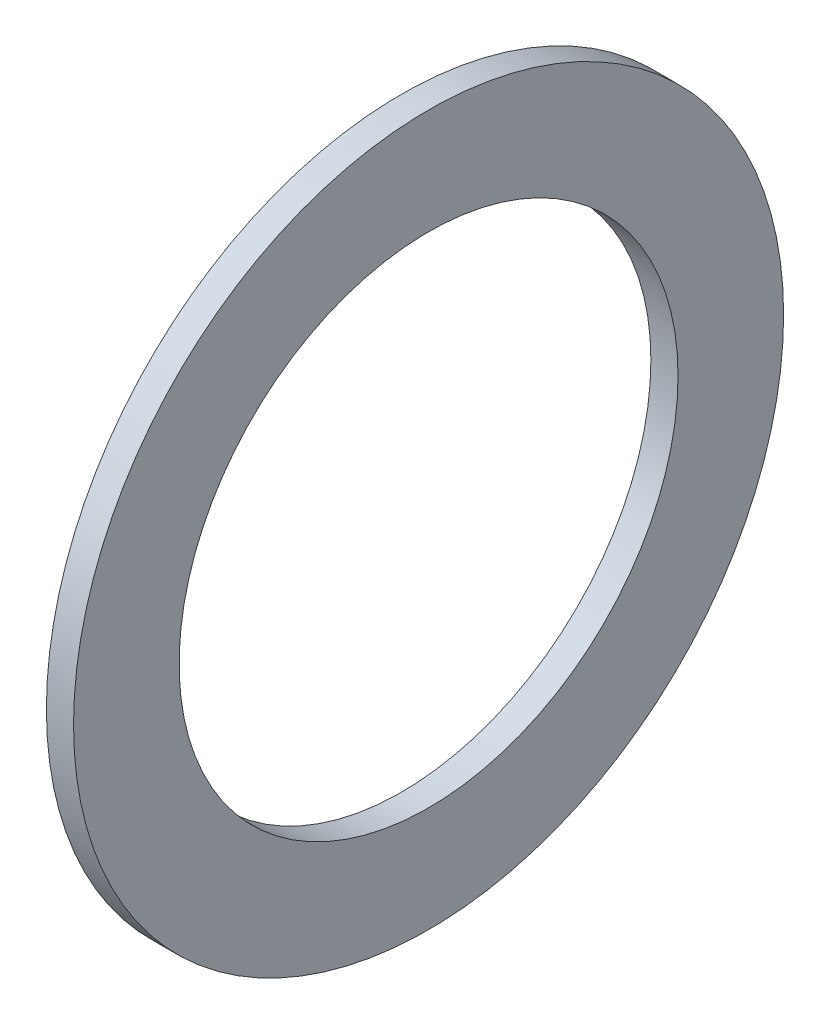
ISO-10303-21;
HEADER;
FILE_DESCRIPTION(('STEP AP214'),'2;1');
FILE_NAME('part.step','',(''),(''),'','','');
FILE_SCHEMA(('AUTOMOTIVE_DESIGN { 1 0 10303 214 1 1 1 1 }'));
ENDSEC;
DATA;
#1=APPLICATION_CONTEXT('core data for automotive mechanical design processes');
#2=APPLICATION_PROTOCOL_DEFINITION('international standard','automotive_design',2000,#1);
#3=PRODUCT_CONTEXT('',#1,'mechanical');
#4=PRODUCT('Part','Part','',(#3));
#5=PRODUCT_RELATED_PRODUCT_CATEGORY('part','',(#4));
#6=PRODUCT_DEFINITION_FORMATION('','',#4);
#7=PRODUCT_DEFINITION_CONTEXT('part definition',#1,'design');
#8=PRODUCT_DEFINITION('design','',#6,#7);
#9=PRODUCT_DEFINITION_SHAPE('','',#8);
#10=(LENGTH_UNIT() NAMED_UNIT(*) SI_UNIT(.MILLI.,.METRE.));
#11=(NAMED_UNIT(*) PLANE_ANGLE_UNIT() SI_UNIT($,.RADIAN.));
#12=(NAMED_UNIT(*) SI_UNIT($,.STERADIAN.) SOLID_ANGLE_UNIT());
#13=UNCERTAINTY_MEASURE_WITH_UNIT(LENGTH_MEASURE(1.E-05),#10,'distance_accuracy_value','');
#14=(GEOMETRIC_REPRESENTATION_CONTEXT(3) GLOBAL_UNCERTAINTY_ASSIGNED_CONTEXT((#13)) GLOBAL_UNIT_ASSIGNED_CONTEXT((#10,
#11,#12)) REPRESENTATION_CONTEXT('',''));
#15=CARTESIAN_POINT('',(0.,0.,0.));
#16=DIRECTION('',(0.,0.,1.));
#17=DIRECTION('',(1.,0.,0.));
#18=AXIS2_PLACEMENT_3D('',#15,#16,#17);
#19=CARTESIAN_POINT('',(0.65,0.,0.));
#20=DIRECTION('',(1.,0.,0.));
#21=DIRECTION('',(0.,0.,-1.));
#22=AXIS2_PLACEMENT_3D('',#19,#20,#21);
#23=PLANE('',#22);
#24=CARTESIAN_POINT('',(0.65,0.,0.));
#25=DIRECTION('',(1.,0.,0.));
#26=DIRECTION('',(0.,0.,-1.));
#27=AXIS2_PLACEMENT_3D('',#24,#25,#26);
#28=CIRCLE('',#27,17.);
#29=CARTESIAN_POINT('',(0.65,0.,-17.));
#30=VERTEX_POINT('',#29);
#31=EDGE_CURVE('E10',#30,#30,#28,.T.);
#32=ORIENTED_EDGE('',*,*,#31,.T.);
#33=EDGE_LOOP('',(#32));
#34=FACE_BOUND('',#33,.T.);
#35=CARTESIAN_POINT('',(0.65,0.,0.));
#36=DIRECTION('',(1.,0.,0.));
#37=DIRECTION('',(0.,0.,-1.));
#38=AXIS2_PLACEMENT_3D('',#35,#36,#37);
#39=CIRCLE('',#38,11.945);
#40=CARTESIAN_POINT('',(0.65,0.,-11.945));
#41=VERTEX_POINT('',#40);
#42=EDGE_CURVE('E47',#41,#41,#39,.T.);
#43=ORIENTED_EDGE('',*,*,#42,.F.);
#44=EDGE_LOOP('',(#43));
#45=FACE_BOUND('',#44,.T.);
#46=ADVANCED_FACE('F36',(#34,#45),#23,.T.);
#47=CARTESIAN_POINT('',(-0.65,0.,0.));
#48=DIRECTION('',(1.,0.,0.));
#49=DIRECTION('',(0.,0.,-1.));
#50=AXIS2_PLACEMENT_3D('',#47,#48,#49);
#51=PLANE('',#50);
#52=CARTESIAN_POINT('',(-0.65,0.,0.));
#53=DIRECTION('',(1.,0.,0.));
#54=DIRECTION('',(0.,0.,-1.));
#55=AXIS2_PLACEMENT_3D('',#52,#53,#54);
#56=CIRCLE('',#55,17.);
#57=CARTESIAN_POINT('',(-0.65,0.,-17.));
#58=VERTEX_POINT('',#57);
#59=EDGE_CURVE('E40',#58,#58,#56,.T.);
#60=ORIENTED_EDGE('',*,*,#59,.F.);
#61=EDGE_LOOP('',(#60));
#62=FACE_BOUND('',#61,.T.);
#63=CARTESIAN_POINT('',(-0.65,0.,0.));
#64=DIRECTION('',(1.,0.,0.));
#65=DIRECTION('',(0.,0.,-1.));
#66=AXIS2_PLACEMENT_3D('',#63,#64,#65);
#67=CIRCLE('',#66,11.945);
#68=CARTESIAN_POINT('',(-0.65,0.,-11.945));
#69=VERTEX_POINT('',#68);
#70=EDGE_CURVE('E49',#69,#69,#67,.T.);
#71=ORIENTED_EDGE('',*,*,#70,.T.);
#72=EDGE_LOOP('',(#71));
#73=FACE_BOUND('',#72,.T.);
#74=ADVANCED_FACE('F59',(#62,#73),#51,.F.);
#75=CARTESIAN_POINT('',(0.65,0.,0.));
#76=DIRECTION('',(-1.,0.,0.));
#77=DIRECTION('',(0.,0.,1.));
#78=AXIS2_PLACEMENT_3D('',#75,#76,#77);
#79=CYLINDRICAL_SURFACE('',#78,17.);
#80=ORIENTED_EDGE('',*,*,#31,.F.);
#81=EDGE_LOOP('',(#80));
#82=FACE_BOUND('',#81,.T.);
#83=ORIENTED_EDGE('',*,*,#59,.T.);
#84=EDGE_LOOP('',(#83));
#85=FACE_BOUND('',#84,.T.);
#86=ADVANCED_FACE('F38',(#82,#85),#79,.T.);
#87=CARTESIAN_POINT('',(0.65,0.,0.));
#88=DIRECTION('',(-1.,0.,0.));
#89=DIRECTION('',(0.,0.,1.));
#90=AXIS2_PLACEMENT_3D('',#87,#88,#89);
#91=CYLINDRICAL_SURFACE('',#90,11.945);
#92=ORIENTED_EDGE('',*,*,#42,.T.);
#93=EDGE_LOOP('',(#92));
#94=FACE_BOUND('',#93,.T.);
#95=ORIENTED_EDGE('',*,*,#70,.F.);
#96=EDGE_LOOP('',(#95));
#97=FACE_BOUND('',#96,.T.);
#98=ADVANCED_FACE('F55',(#94,#97),#91,.F.);
#99=CLOSED_SHELL('',(#46,#74,#86,#98));
#100=MANIFOLD_SOLID_BREP('B2',#99);
#101=ADVANCED_BREP_SHAPE_REPRESENTATION('',(#18,#100),#14);
#102=SHAPE_DEFINITION_REPRESENTATION(#9,#101);
ENDSEC;
END-ISO-10303-21;
